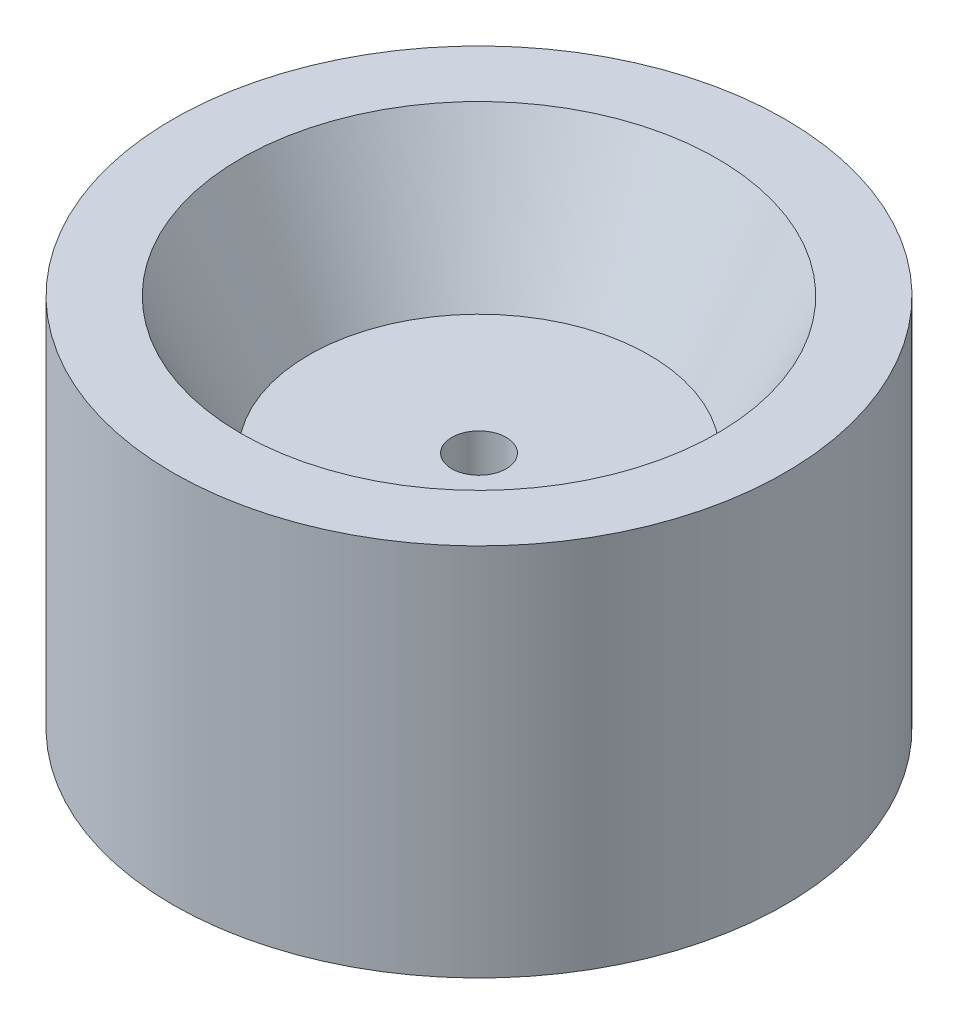
ISO-10303-21;
HEADER;
FILE_DESCRIPTION(('STEP AP214'),'2;1');
FILE_NAME('part.step','',(''),(''),'','','');
FILE_SCHEMA(('AUTOMOTIVE_DESIGN { 1 0 10303 214 1 1 1 1 }'));
ENDSEC;
DATA;
#1=APPLICATION_CONTEXT('core data for automotive mechanical design processes');
#2=APPLICATION_PROTOCOL_DEFINITION('international standard','automotive_design',2000,#1);
#3=PRODUCT_CONTEXT('',#1,'mechanical');
#4=PRODUCT('Part','Part','',(#3));
#5=PRODUCT_RELATED_PRODUCT_CATEGORY('part','',(#4));
#6=PRODUCT_DEFINITION_FORMATION('','',#4);
#7=PRODUCT_DEFINITION_CONTEXT('part definition',#1,'design');
#8=PRODUCT_DEFINITION('design','',#6,#7);
#9=PRODUCT_DEFINITION_SHAPE('','',#8);
#10=(LENGTH_UNIT() NAMED_UNIT(*) SI_UNIT(.MILLI.,.METRE.));
#11=(NAMED_UNIT(*) PLANE_ANGLE_UNIT() SI_UNIT($,.RADIAN.));
#12=(NAMED_UNIT(*) SI_UNIT($,.STERADIAN.) SOLID_ANGLE_UNIT());
#13=UNCERTAINTY_MEASURE_WITH_UNIT(LENGTH_MEASURE(1.E-05),#10,'distance_accuracy_value','');
#14=(GEOMETRIC_REPRESENTATION_CONTEXT(3) GLOBAL_UNCERTAINTY_ASSIGNED_CONTEXT((#13)) GLOBAL_UNIT_ASSIGNED_CONTEXT((#10,
#11,#12)) REPRESENTATION_CONTEXT('',''));
#15=CARTESIAN_POINT('',(0.,0.,0.));
#16=DIRECTION('',(0.,0.,1.));
#17=DIRECTION('',(1.,0.,0.));
#18=AXIS2_PLACEMENT_3D('',#15,#16,#17);
#19=CARTESIAN_POINT('',(0.,55.,0.));
#20=DIRECTION('',(0.,-1.,0.));
#21=DIRECTION('',(0.,0.,-1.));
#22=AXIS2_PLACEMENT_3D('',#19,#20,#21);
#23=CYLINDRICAL_SURFACE('',#22,45.);
#24=CARTESIAN_POINT('',(0.,55.,0.));
#25=DIRECTION('',(0.,1.,0.));
#26=DIRECTION('',(0.,0.,1.));
#27=AXIS2_PLACEMENT_3D('',#24,#25,#26);
#28=CIRCLE('',#27,45.);
#29=CARTESIAN_POINT('',(0.,55.,45.));
#30=VERTEX_POINT('',#29);
#31=EDGE_CURVE('E10',#30,#30,#28,.T.);
#32=ORIENTED_EDGE('',*,*,#31,.F.);
#33=EDGE_LOOP('',(#32));
#34=FACE_BOUND('',#33,.T.);
#35=CARTESIAN_POINT('',(0.,0.,0.));
#36=DIRECTION('',(0.,1.,0.));
#37=DIRECTION('',(0.,0.,1.));
#38=AXIS2_PLACEMENT_3D('',#35,#36,#37);
#39=CIRCLE('',#38,45.);
#40=CARTESIAN_POINT('',(0.,0.,45.));
#41=VERTEX_POINT('',#40);
#42=EDGE_CURVE('E47',#41,#41,#39,.T.);
#43=ORIENTED_EDGE('',*,*,#42,.T.);
#44=EDGE_LOOP('',(#43));
#45=FACE_BOUND('',#44,.T.);
#46=ADVANCED_FACE('F44',(#34,#45),#23,.T.);
#47=CARTESIAN_POINT('',(0.,55.,0.));
#48=DIRECTION('',(0.,1.,0.));
#49=DIRECTION('',(0.,0.,1.));
#50=AXIS2_PLACEMENT_3D('',#47,#48,#49);
#51=PLANE('',#50);
#52=CARTESIAN_POINT('',(0.,55.,0.));
#53=DIRECTION('',(0.,1.,0.));
#54=DIRECTION('',(0.,0.,1.));
#55=AXIS2_PLACEMENT_3D('',#52,#53,#54);
#56=CIRCLE('',#55,35.);
#57=CARTESIAN_POINT('',(0.,55.,35.));
#58=VERTEX_POINT('',#57);
#59=EDGE_CURVE('E60',#58,#58,#56,.T.);
#60=ORIENTED_EDGE('',*,*,#59,.F.);
#61=EDGE_LOOP('',(#60));
#62=FACE_BOUND('',#61,.T.);
#63=ORIENTED_EDGE('',*,*,#31,.T.);
#64=EDGE_LOOP('',(#63));
#65=FACE_BOUND('',#64,.T.);
#66=ADVANCED_FACE('F89',(#62,#65),#51,.T.);
#67=CARTESIAN_POINT('',(0.,0.,0.));
#68=DIRECTION('',(0.,1.,0.));
#69=DIRECTION('',(0.,0.,1.));
#70=AXIS2_PLACEMENT_3D('',#67,#68,#69);
#71=PLANE('',#70);
#72=CARTESIAN_POINT('',(0.,0.,0.));
#73=DIRECTION('',(0.,1.,0.));
#74=DIRECTION('',(0.,0.,1.));
#75=AXIS2_PLACEMENT_3D('',#72,#73,#74);
#76=CIRCLE('',#75,35.);
#77=CARTESIAN_POINT('',(0.,0.,35.));
#78=VERTEX_POINT('',#77);
#79=EDGE_CURVE('E59',#78,#78,#76,.T.);
#80=ORIENTED_EDGE('',*,*,#79,.T.);
#81=EDGE_LOOP('',(#80));
#82=FACE_BOUND('',#81,.T.);
#83=ORIENTED_EDGE('',*,*,#42,.F.);
#84=EDGE_LOOP('',(#83));
#85=FACE_BOUND('',#84,.T.);
#86=ADVANCED_FACE('F91',(#82,#85),#71,.F.);
#87=CARTESIAN_POINT('',(0.,20.,25.));
#88=DIRECTION('',(0.,1.,0.));
#89=DIRECTION('',(0.,0.,1.));
#90=AXIS2_PLACEMENT_3D('',#87,#88,#89);
#91=PLANE('',#90);
#92=CARTESIAN_POINT('',(0.,20.,0.));
#93=DIRECTION('',(0.,1.,0.));
#94=DIRECTION('',(0.,0.,1.));
#95=AXIS2_PLACEMENT_3D('',#92,#93,#94);
#96=CIRCLE('',#95,4.);
#97=CARTESIAN_POINT('',(0.,20.,4.));
#98=VERTEX_POINT('',#97);
#99=EDGE_CURVE('E63',#98,#98,#96,.F.);
#100=ORIENTED_EDGE('',*,*,#99,.F.);
#101=EDGE_LOOP('',(#100));
#102=FACE_BOUND('',#101,.T.);
#103=CARTESIAN_POINT('',(0.,20.,0.));
#104=DIRECTION('',(0.,1.,0.));
#105=DIRECTION('',(0.,0.,1.));
#106=AXIS2_PLACEMENT_3D('',#103,#104,#105);
#107=CIRCLE('',#106,25.);
#108=CARTESIAN_POINT('',(0.,20.,25.));
#109=VERTEX_POINT('',#108);
#110=EDGE_CURVE('E54',#109,#109,#107,.T.);
#111=ORIENTED_EDGE('',*,*,#110,.F.);
#112=EDGE_LOOP('',(#111));
#113=FACE_BOUND('',#112,.T.);
#114=ADVANCED_FACE('F97',(#102,#113),#91,.F.);
#115=CARTESIAN_POINT('',(0.,20.,0.));
#116=DIRECTION('',(0.,-1.,0.));
#117=DIRECTION('',(0.,0.,-1.));
#118=AXIS2_PLACEMENT_3D('',#115,#116,#117);
#119=CONICAL_SURFACE('',#118,25.,0.463647609000806);
#120=ORIENTED_EDGE('',*,*,#79,.F.);
#121=EDGE_LOOP('',(#120));
#122=FACE_BOUND('',#121,.T.);
#123=ORIENTED_EDGE('',*,*,#110,.T.);
#124=EDGE_LOOP('',(#123));
#125=FACE_BOUND('',#124,.T.);
#126=ADVANCED_FACE('F80',(#122,#125),#119,.F.);
#127=CARTESIAN_POINT('',(0.,35.,25.));
#128=DIRECTION('',(0.,-1.,0.));
#129=DIRECTION('',(0.,0.,-1.));
#130=AXIS2_PLACEMENT_3D('',#127,#128,#129);
#131=PLANE('',#130);
#132=CARTESIAN_POINT('',(0.,35.,0.));
#133=DIRECTION('',(0.,1.,0.));
#134=DIRECTION('',(0.,0.,1.));
#135=AXIS2_PLACEMENT_3D('',#132,#133,#134);
#136=CIRCLE('',#135,4.);
#137=CARTESIAN_POINT('',(0.,35.,4.));
#138=VERTEX_POINT('',#137);
#139=EDGE_CURVE('E70',#138,#138,#136,.T.);
#140=ORIENTED_EDGE('',*,*,#139,.F.);
#141=EDGE_LOOP('',(#140));
#142=FACE_BOUND('',#141,.T.);
#143=CARTESIAN_POINT('',(0.,35.,0.));
#144=DIRECTION('',(0.,1.,0.));
#145=DIRECTION('',(0.,0.,1.));
#146=AXIS2_PLACEMENT_3D('',#143,#144,#145);
#147=CIRCLE('',#146,25.);
#148=CARTESIAN_POINT('',(0.,35.,25.));
#149=VERTEX_POINT('',#148);
#150=EDGE_CURVE('E56',#149,#149,#147,.T.);
#151=ORIENTED_EDGE('',*,*,#150,.T.);
#152=EDGE_LOOP('',(#151));
#153=FACE_BOUND('',#152,.T.);
#154=ADVANCED_FACE('F76',(#142,#153),#131,.F.);
#155=CARTESIAN_POINT('',(0.,55.,0.));
#156=DIRECTION('',(0.,1.,0.));
#157=DIRECTION('',(0.,0.,1.));
#158=AXIS2_PLACEMENT_3D('',#155,#156,#157);
#159=CONICAL_SURFACE('',#158,35.,0.463647609000806);
#160=ORIENTED_EDGE('',*,*,#150,.F.);
#161=EDGE_LOOP('',(#160));
#162=FACE_BOUND('',#161,.T.);
#163=ORIENTED_EDGE('',*,*,#59,.T.);
#164=EDGE_LOOP('',(#163));
#165=FACE_BOUND('',#164,.T.);
#166=ADVANCED_FACE('F79',(#162,#165),#159,.F.);
#167=CARTESIAN_POINT('',(0.,8.68629150101525,0.));
#168=DIRECTION('',(0.,1.,0.));
#169=DIRECTION('',(0.,0.,1.));
#170=AXIS2_PLACEMENT_3D('',#167,#168,#169);
#171=CYLINDRICAL_SURFACE('',#170,4.);
#172=ORIENTED_EDGE('',*,*,#99,.T.);
#173=EDGE_LOOP('',(#172));
#174=FACE_BOUND('',#173,.T.);
#175=ORIENTED_EDGE('',*,*,#139,.T.);
#176=EDGE_LOOP('',(#175));
#177=FACE_BOUND('',#176,.T.);
#178=ADVANCED_FACE('F74',(#174,#177),#171,.F.);
#179=CLOSED_SHELL('',(#46,#66,#86,#114,#126,#154,#166,#178));
#180=MANIFOLD_SOLID_BREP('B2',#179);
#181=ADVANCED_BREP_SHAPE_REPRESENTATION('',(#18,#180),#14);
#182=SHAPE_DEFINITION_REPRESENTATION(#9,#181);
ENDSEC;
END-ISO-10303-21;
